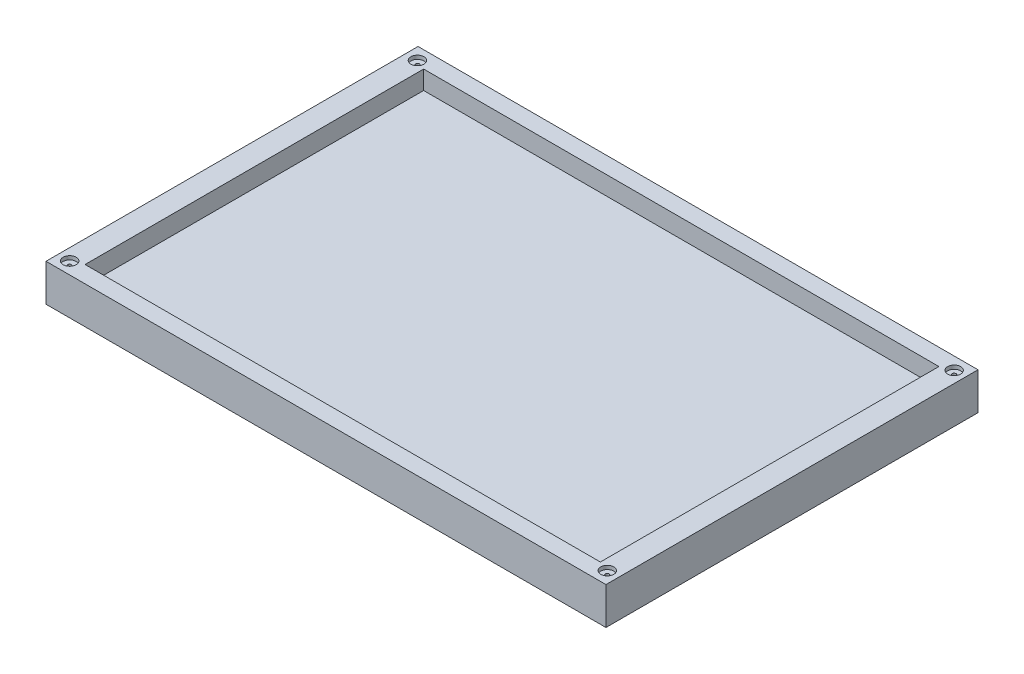
ISO-10303-21;
HEADER;
FILE_DESCRIPTION(('STEP AP214'),'2;1');
FILE_NAME('part.step','',(''),(''),'','','');
FILE_SCHEMA(('AUTOMOTIVE_DESIGN { 1 0 10303 214 1 1 1 1 }'));
ENDSEC;
DATA;
#1=APPLICATION_CONTEXT('core data for automotive mechanical design processes');
#2=APPLICATION_PROTOCOL_DEFINITION('international standard','automotive_design',2000,#1);
#3=PRODUCT_CONTEXT('',#1,'mechanical');
#4=PRODUCT('Part','Part','',(#3));
#5=PRODUCT_RELATED_PRODUCT_CATEGORY('part','',(#4));
#6=PRODUCT_DEFINITION_FORMATION('','',#4);
#7=PRODUCT_DEFINITION_CONTEXT('part definition',#1,'design');
#8=PRODUCT_DEFINITION('design','',#6,#7);
#9=PRODUCT_DEFINITION_SHAPE('','',#8);
#10=(LENGTH_UNIT() NAMED_UNIT(*) SI_UNIT(.MILLI.,.METRE.));
#11=(NAMED_UNIT(*) PLANE_ANGLE_UNIT() SI_UNIT($,.RADIAN.));
#12=(NAMED_UNIT(*) SI_UNIT($,.STERADIAN.) SOLID_ANGLE_UNIT());
#13=UNCERTAINTY_MEASURE_WITH_UNIT(LENGTH_MEASURE(1.E-05),#10,'distance_accuracy_value','');
#14=(GEOMETRIC_REPRESENTATION_CONTEXT(3) GLOBAL_UNCERTAINTY_ASSIGNED_CONTEXT((#13)) GLOBAL_UNIT_ASSIGNED_CONTEXT((#10,
#11,#12)) REPRESENTATION_CONTEXT('',''));
#15=CARTESIAN_POINT('',(0.,0.,0.));
#16=DIRECTION('',(0.,0.,1.));
#17=DIRECTION('',(1.,0.,0.));
#18=AXIS2_PLACEMENT_3D('',#15,#16,#17);
#19=CARTESIAN_POINT('',(0.,5.,0.));
#20=DIRECTION('',(1.,0.,0.));
#21=DIRECTION('',(0.,0.,-1.));
#22=AXIS2_PLACEMENT_3D('',#19,#20,#21);
#23=PLANE('',#22);
#24=DIRECTION('',(0.,0.,1.));
#25=VECTOR('',#24,1.);
#26=CARTESIAN_POINT('',(0.,-5.,0.));
#27=LINE('',#26,#25);
#28=CARTESIAN_POINT('',(0.,-5.,-100.));
#29=VERTEX_POINT('',#28);
#30=CARTESIAN_POINT('',(0.,-5.,0.));
#31=VERTEX_POINT('',#30);
#32=EDGE_CURVE('E145',#29,#31,#27,.T.);
#33=ORIENTED_EDGE('',*,*,#32,.T.);
#34=DIRECTION('',(0.,-1.,0.));
#35=VECTOR('',#34,1.);
#36=CARTESIAN_POINT('',(0.,5.,0.));
#37=LINE('',#36,#35);
#38=CARTESIAN_POINT('',(0.,5.,0.));
#39=VERTEX_POINT('',#38);
#40=EDGE_CURVE('E11',#39,#31,#37,.T.);
#41=ORIENTED_EDGE('',*,*,#40,.F.);
#42=DIRECTION('',(0.,0.,1.));
#43=VECTOR('',#42,1.);
#44=CARTESIAN_POINT('',(0.,5.,0.));
#45=LINE('',#44,#43);
#46=CARTESIAN_POINT('',(0.,5.,-100.));
#47=VERTEX_POINT('',#46);
#48=EDGE_CURVE('E149',#47,#39,#45,.T.);
#49=ORIENTED_EDGE('',*,*,#48,.F.);
#50=DIRECTION('',(0.,-1.,0.));
#51=VECTOR('',#50,1.);
#52=CARTESIAN_POINT('',(0.,5.,-100.));
#53=LINE('',#52,#51);
#54=EDGE_CURVE('E155',#47,#29,#53,.T.);
#55=ORIENTED_EDGE('',*,*,#54,.T.);
#56=EDGE_LOOP('',(#33,#41,#49,#55));
#57=FACE_BOUND('',#56,.T.);
#58=ADVANCED_FACE('F33',(#57),#23,.F.);
#59=CARTESIAN_POINT('',(0.,5.,0.));
#60=DIRECTION('',(0.,0.,-1.));
#61=DIRECTION('',(-1.,0.,0.));
#62=AXIS2_PLACEMENT_3D('',#59,#60,#61);
#63=PLANE('',#62);
#64=DIRECTION('',(1.,0.,0.));
#65=VECTOR('',#64,1.);
#66=CARTESIAN_POINT('',(0.,-5.,0.));
#67=LINE('',#66,#65);
#68=CARTESIAN_POINT('',(150.5,-5.,0.));
#69=VERTEX_POINT('',#68);
#70=EDGE_CURVE('E158',#31,#69,#67,.T.);
#71=ORIENTED_EDGE('',*,*,#70,.T.);
#72=DIRECTION('',(0.,-1.,0.));
#73=VECTOR('',#72,1.);
#74=CARTESIAN_POINT('',(150.5,5.,0.));
#75=LINE('',#74,#73);
#76=CARTESIAN_POINT('',(150.5,5.,0.));
#77=VERTEX_POINT('',#76);
#78=EDGE_CURVE('E40',#77,#69,#75,.T.);
#79=ORIENTED_EDGE('',*,*,#78,.F.);
#80=DIRECTION('',(1.,0.,0.));
#81=VECTOR('',#80,1.);
#82=CARTESIAN_POINT('',(0.,5.,0.));
#83=LINE('',#82,#81);
#84=EDGE_CURVE('E84',#39,#77,#83,.T.);
#85=ORIENTED_EDGE('',*,*,#84,.F.);
#86=ORIENTED_EDGE('',*,*,#40,.T.);
#87=EDGE_LOOP('',(#71,#79,#85,#86));
#88=FACE_BOUND('',#87,.T.);
#89=ADVANCED_FACE('F187',(#88),#63,.F.);
#90=CARTESIAN_POINT('',(150.5,5.,0.));
#91=DIRECTION('',(-1.,0.,0.));
#92=DIRECTION('',(0.,0.,1.));
#93=AXIS2_PLACEMENT_3D('',#90,#91,#92);
#94=PLANE('',#93);
#95=DIRECTION('',(0.,0.,-1.));
#96=VECTOR('',#95,1.);
#97=CARTESIAN_POINT('',(150.5,-5.,0.));
#98=LINE('',#97,#96);
#99=CARTESIAN_POINT('',(150.5,-5.,-100.));
#100=VERTEX_POINT('',#99);
#101=EDGE_CURVE('E160',#69,#100,#98,.T.);
#102=ORIENTED_EDGE('',*,*,#101,.T.);
#103=DIRECTION('',(0.,-1.,0.));
#104=VECTOR('',#103,1.);
#105=CARTESIAN_POINT('',(150.5,5.,-100.));
#106=LINE('',#105,#104);
#107=CARTESIAN_POINT('',(150.5,5.,-100.));
#108=VERTEX_POINT('',#107);
#109=EDGE_CURVE('E164',#108,#100,#106,.T.);
#110=ORIENTED_EDGE('',*,*,#109,.F.);
#111=DIRECTION('',(0.,0.,-1.));
#112=VECTOR('',#111,1.);
#113=CARTESIAN_POINT('',(150.5,5.,0.));
#114=LINE('',#113,#112);
#115=EDGE_CURVE('E152',#77,#108,#114,.T.);
#116=ORIENTED_EDGE('',*,*,#115,.F.);
#117=ORIENTED_EDGE('',*,*,#78,.T.);
#118=EDGE_LOOP('',(#102,#110,#116,#117));
#119=FACE_BOUND('',#118,.T.);
#120=ADVANCED_FACE('F169',(#119),#94,.F.);
#121=CARTESIAN_POINT('',(0.,5.,-100.));
#122=DIRECTION('',(0.,0.,1.));
#123=DIRECTION('',(1.,0.,0.));
#124=AXIS2_PLACEMENT_3D('',#121,#122,#123);
#125=PLANE('',#124);
#126=DIRECTION('',(-1.,0.,0.));
#127=VECTOR('',#126,1.);
#128=CARTESIAN_POINT('',(0.,-5.,-100.));
#129=LINE('',#128,#127);
#130=EDGE_CURVE('E77',#100,#29,#129,.T.);
#131=ORIENTED_EDGE('',*,*,#130,.T.);
#132=ORIENTED_EDGE('',*,*,#54,.F.);
#133=DIRECTION('',(-1.,0.,0.));
#134=VECTOR('',#133,1.);
#135=CARTESIAN_POINT('',(0.,5.,-100.));
#136=LINE('',#135,#134);
#137=EDGE_CURVE('E56',#108,#47,#136,.T.);
#138=ORIENTED_EDGE('',*,*,#137,.F.);
#139=ORIENTED_EDGE('',*,*,#109,.T.);
#140=EDGE_LOOP('',(#131,#132,#138,#139));
#141=FACE_BOUND('',#140,.T.);
#142=ADVANCED_FACE('F177',(#141),#125,.F.);
#143=CARTESIAN_POINT('',(0.,5.,0.));
#144=DIRECTION('',(0.,-1.,0.));
#145=DIRECTION('',(0.,0.,-1.));
#146=AXIS2_PLACEMENT_3D('',#143,#144,#145);
#147=PLANE('',#146);
#148=CARTESIAN_POINT('',(147.430623057517,5.,-96.6621357084492));
#149=DIRECTION('',(0.,1.,0.));
#150=DIRECTION('',(0.,0.,1.));
#151=AXIS2_PLACEMENT_3D('',#148,#149,#150);
#152=CIRCLE('',#151,1.75000000000001);
#153=CARTESIAN_POINT('',(147.430623057517,5.,-94.9121357084492));
#154=VERTEX_POINT('',#153);
#155=EDGE_CURVE('E428',#154,#154,#152,.T.);
#156=ORIENTED_EDGE('',*,*,#155,.F.);
#157=EDGE_LOOP('',(#156));
#158=FACE_BOUND('',#157,.T.);
#159=CARTESIAN_POINT('',(147.430623057517,5.,-3.43690086949189));
#160=DIRECTION('',(0.,1.,0.));
#161=DIRECTION('',(0.,0.,1.));
#162=AXIS2_PLACEMENT_3D('',#159,#160,#161);
#163=CIRCLE('',#162,1.75000000000001);
#164=CARTESIAN_POINT('',(147.430623057517,5.,-1.68690086949188));
#165=VERTEX_POINT('',#164);
#166=EDGE_CURVE('E450',#165,#165,#163,.T.);
#167=ORIENTED_EDGE('',*,*,#166,.F.);
#168=EDGE_LOOP('',(#167));
#169=FACE_BOUND('',#168,.T.);
#170=CARTESIAN_POINT('',(3.10278833403273,5.,-3.2545276414705));
#171=DIRECTION('',(0.,1.,0.));
#172=DIRECTION('',(0.,0.,1.));
#173=AXIS2_PLACEMENT_3D('',#170,#171,#172);
#174=CIRCLE('',#173,1.75);
#175=CARTESIAN_POINT('',(3.10278833403273,5.,-1.5045276414705));
#176=VERTEX_POINT('',#175);
#177=EDGE_CURVE('E444',#176,#176,#174,.T.);
#178=ORIENTED_EDGE('',*,*,#177,.F.);
#179=EDGE_LOOP('',(#178));
#180=FACE_BOUND('',#179,.T.);
#181=CARTESIAN_POINT('',(3.15907973459417,5.,-96.6621357084492));
#182=DIRECTION('',(0.,1.,0.));
#183=DIRECTION('',(0.,0.,1.));
#184=AXIS2_PLACEMENT_3D('',#181,#182,#183);
#185=CIRCLE('',#184,1.75);
#186=CARTESIAN_POINT('',(3.15907973459417,5.,-94.9121357084492));
#187=VERTEX_POINT('',#186);
#188=EDGE_CURVE('E132',#187,#187,#185,.T.);
#189=ORIENTED_EDGE('',*,*,#188,.F.);
#190=EDGE_LOOP('',(#189));
#191=FACE_BOUND('',#190,.T.);
#192=DIRECTION('',(1.,0.,0.));
#193=VECTOR('',#192,1.);
#194=CARTESIAN_POINT('',(6.00000000000001,5.,-4.5));
#195=LINE('',#194,#193);
#196=CARTESIAN_POINT('',(6.00000000000001,5.,-4.5));
#197=VERTEX_POINT('',#196);
#198=CARTESIAN_POINT('',(144.5,5.,-4.5));
#199=VERTEX_POINT('',#198);
#200=EDGE_CURVE('E138',#197,#199,#195,.T.);
#201=ORIENTED_EDGE('',*,*,#200,.F.);
#202=DIRECTION('',(0.,0.,1.));
#203=VECTOR('',#202,1.);
#204=CARTESIAN_POINT('',(6.,5.,-95.5));
#205=LINE('',#204,#203);
#206=CARTESIAN_POINT('',(6.,5.,-95.5));
#207=VERTEX_POINT('',#206);
#208=EDGE_CURVE('E47',#207,#197,#205,.T.);
#209=ORIENTED_EDGE('',*,*,#208,.F.);
#210=DIRECTION('',(-1.,0.,0.));
#211=VECTOR('',#210,1.);
#212=CARTESIAN_POINT('',(6.,5.,-95.5));
#213=LINE('',#212,#211);
#214=CARTESIAN_POINT('',(144.5,5.,-95.5));
#215=VERTEX_POINT('',#214);
#216=EDGE_CURVE('E126',#215,#207,#213,.T.);
#217=ORIENTED_EDGE('',*,*,#216,.F.);
#218=DIRECTION('',(0.,0.,-1.));
#219=VECTOR('',#218,1.);
#220=CARTESIAN_POINT('',(144.5,5.,-95.5));
#221=LINE('',#220,#219);
#222=EDGE_CURVE('E129',#199,#215,#221,.T.);
#223=ORIENTED_EDGE('',*,*,#222,.F.);
#224=EDGE_LOOP('',(#201,#209,#217,#223));
#225=FACE_BOUND('',#224,.T.);
#226=ORIENTED_EDGE('',*,*,#48,.T.);
#227=ORIENTED_EDGE('',*,*,#84,.T.);
#228=ORIENTED_EDGE('',*,*,#115,.T.);
#229=ORIENTED_EDGE('',*,*,#137,.T.);
#230=EDGE_LOOP('',(#226,#227,#228,#229));
#231=FACE_BOUND('',#230,.T.);
#232=ADVANCED_FACE('F179',(#158,#169,#180,#191,#225,#231),#147,.F.);
#233=CARTESIAN_POINT('',(0.,-5.,0.));
#234=DIRECTION('',(0.,-1.,0.));
#235=DIRECTION('',(0.,0.,-1.));
#236=AXIS2_PLACEMENT_3D('',#233,#234,#235);
#237=PLANE('',#236);
#238=ORIENTED_EDGE('',*,*,#32,.F.);
#239=ORIENTED_EDGE('',*,*,#130,.F.);
#240=ORIENTED_EDGE('',*,*,#101,.F.);
#241=ORIENTED_EDGE('',*,*,#70,.F.);
#242=EDGE_LOOP('',(#238,#239,#240,#241));
#243=FACE_BOUND('',#242,.T.);
#244=ADVANCED_FACE('F173',(#243),#237,.T.);
#245=CARTESIAN_POINT('',(6.,0.,-95.5));
#246=DIRECTION('',(-1.,0.,0.));
#247=DIRECTION('',(0.,0.,1.));
#248=AXIS2_PLACEMENT_3D('',#245,#246,#247);
#249=PLANE('',#248);
#250=ORIENTED_EDGE('',*,*,#208,.T.);
#251=DIRECTION('',(0.,1.,0.));
#252=VECTOR('',#251,1.);
#253=CARTESIAN_POINT('',(6.00000000000001,0.,-4.5));
#254=LINE('',#253,#252);
#255=CARTESIAN_POINT('',(6.00000000000001,0.,-4.5));
#256=VERTEX_POINT('',#255);
#257=EDGE_CURVE('E104',#256,#197,#254,.T.);
#258=ORIENTED_EDGE('',*,*,#257,.F.);
#259=DIRECTION('',(0.,0.,1.));
#260=VECTOR('',#259,1.);
#261=CARTESIAN_POINT('',(6.,0.,-95.5));
#262=LINE('',#261,#260);
#263=CARTESIAN_POINT('',(6.,0.,-95.5));
#264=VERTEX_POINT('',#263);
#265=EDGE_CURVE('E108',#264,#256,#262,.T.);
#266=ORIENTED_EDGE('',*,*,#265,.F.);
#267=DIRECTION('',(0.,1.,0.));
#268=VECTOR('',#267,1.);
#269=CARTESIAN_POINT('',(6.,0.,-95.5));
#270=LINE('',#269,#268);
#271=EDGE_CURVE('E143',#264,#207,#270,.T.);
#272=ORIENTED_EDGE('',*,*,#271,.T.);
#273=EDGE_LOOP('',(#250,#258,#266,#272));
#274=FACE_BOUND('',#273,.T.);
#275=ADVANCED_FACE('F106',(#274),#249,.F.);
#276=CARTESIAN_POINT('',(6.,0.,-95.5));
#277=DIRECTION('',(0.,0.,-1.));
#278=DIRECTION('',(-1.,0.,0.));
#279=AXIS2_PLACEMENT_3D('',#276,#277,#278);
#280=PLANE('',#279);
#281=ORIENTED_EDGE('',*,*,#216,.T.);
#282=ORIENTED_EDGE('',*,*,#271,.F.);
#283=DIRECTION('',(-1.,0.,0.));
#284=VECTOR('',#283,1.);
#285=CARTESIAN_POINT('',(6.,0.,-95.5));
#286=LINE('',#285,#284);
#287=CARTESIAN_POINT('',(144.5,0.,-95.5));
#288=VERTEX_POINT('',#287);
#289=EDGE_CURVE('E114',#288,#264,#286,.T.);
#290=ORIENTED_EDGE('',*,*,#289,.F.);
#291=DIRECTION('',(0.,1.,0.));
#292=VECTOR('',#291,1.);
#293=CARTESIAN_POINT('',(144.5,0.,-95.5));
#294=LINE('',#293,#292);
#295=EDGE_CURVE('E146',#288,#215,#294,.T.);
#296=ORIENTED_EDGE('',*,*,#295,.T.);
#297=EDGE_LOOP('',(#281,#282,#290,#296));
#298=FACE_BOUND('',#297,.T.);
#299=ADVANCED_FACE('F221',(#298),#280,.F.);
#300=CARTESIAN_POINT('',(144.5,0.,-95.5));
#301=DIRECTION('',(1.,0.,0.));
#302=DIRECTION('',(0.,0.,-1.));
#303=AXIS2_PLACEMENT_3D('',#300,#301,#302);
#304=PLANE('',#303);
#305=ORIENTED_EDGE('',*,*,#222,.T.);
#306=ORIENTED_EDGE('',*,*,#295,.F.);
#307=DIRECTION('',(0.,0.,-1.));
#308=VECTOR('',#307,1.);
#309=CARTESIAN_POINT('',(144.5,0.,-95.5));
#310=LINE('',#309,#308);
#311=CARTESIAN_POINT('',(144.5,0.,-4.5));
#312=VERTEX_POINT('',#311);
#313=EDGE_CURVE('E122',#312,#288,#310,.T.);
#314=ORIENTED_EDGE('',*,*,#313,.F.);
#315=DIRECTION('',(0.,1.,0.));
#316=VECTOR('',#315,1.);
#317=CARTESIAN_POINT('',(144.5,0.,-4.5));
#318=LINE('',#317,#316);
#319=EDGE_CURVE('E113',#312,#199,#318,.T.);
#320=ORIENTED_EDGE('',*,*,#319,.T.);
#321=EDGE_LOOP('',(#305,#306,#314,#320));
#322=FACE_BOUND('',#321,.T.);
#323=ADVANCED_FACE('F230',(#322),#304,.F.);
#324=CARTESIAN_POINT('',(6.00000000000001,0.,-4.5));
#325=DIRECTION('',(0.,0.,1.));
#326=DIRECTION('',(1.,0.,0.));
#327=AXIS2_PLACEMENT_3D('',#324,#325,#326);
#328=PLANE('',#327);
#329=ORIENTED_EDGE('',*,*,#200,.T.);
#330=ORIENTED_EDGE('',*,*,#319,.F.);
#331=DIRECTION('',(1.,0.,0.));
#332=VECTOR('',#331,1.);
#333=CARTESIAN_POINT('',(6.00000000000001,0.,-4.5));
#334=LINE('',#333,#332);
#335=EDGE_CURVE('E117',#256,#312,#334,.T.);
#336=ORIENTED_EDGE('',*,*,#335,.F.);
#337=ORIENTED_EDGE('',*,*,#257,.T.);
#338=EDGE_LOOP('',(#329,#330,#336,#337));
#339=FACE_BOUND('',#338,.T.);
#340=ADVANCED_FACE('F118',(#339),#328,.F.);
#341=CARTESIAN_POINT('',(0.,0.,0.));
#342=DIRECTION('',(0.,1.,0.));
#343=DIRECTION('',(0.,0.,1.));
#344=AXIS2_PLACEMENT_3D('',#341,#342,#343);
#345=PLANE('',#344);
#346=ORIENTED_EDGE('',*,*,#265,.T.);
#347=ORIENTED_EDGE('',*,*,#335,.T.);
#348=ORIENTED_EDGE('',*,*,#313,.T.);
#349=ORIENTED_EDGE('',*,*,#289,.T.);
#350=EDGE_LOOP('',(#346,#347,#348,#349));
#351=FACE_BOUND('',#350,.T.);
#352=ADVANCED_FACE('F124',(#351),#345,.T.);
#353=CARTESIAN_POINT('',(3.15907973459417,4.,-96.6621357084492));
#354=DIRECTION('',(0.,1.,0.));
#355=DIRECTION('',(0.,0.,1.));
#356=AXIS2_PLACEMENT_3D('',#353,#354,#355);
#357=CYLINDRICAL_SURFACE('',#356,1.75);
#358=CARTESIAN_POINT('',(3.15907973459417,4.,-96.6621357084492));
#359=DIRECTION('',(0.,1.,0.));
#360=DIRECTION('',(0.,0.,1.));
#361=AXIS2_PLACEMENT_3D('',#358,#359,#360);
#362=CIRCLE('',#361,1.75);
#363=CARTESIAN_POINT('',(3.15907973459417,4.,-94.9121357084492));
#364=VERTEX_POINT('',#363);
#365=EDGE_CURVE('E139',#364,#364,#362,.T.);
#366=ORIENTED_EDGE('',*,*,#365,.F.);
#367=EDGE_LOOP('',(#366));
#368=FACE_BOUND('',#367,.T.);
#369=ORIENTED_EDGE('',*,*,#188,.T.);
#370=EDGE_LOOP('',(#369));
#371=FACE_BOUND('',#370,.T.);
#372=ADVANCED_FACE('F257',(#368,#371),#357,.F.);
#373=CARTESIAN_POINT('',(3.15907973459417,4.,-96.6621357084492));
#374=DIRECTION('',(0.,1.,0.));
#375=DIRECTION('',(0.,0.,1.));
#376=AXIS2_PLACEMENT_3D('',#373,#374,#375);
#377=PLANE('',#376);
#378=CARTESIAN_POINT('',(3.21252490637036,4.,-96.6472310601318));
#379=DIRECTION('',(0.,1.,0.));
#380=DIRECTION('',(0.,0.,1.));
#381=AXIS2_PLACEMENT_3D('',#378,#379,#380);
#382=CIRCLE('',#381,0.5);
#383=CARTESIAN_POINT('',(3.21252490637036,4.,-96.1472310601318));
#384=VERTEX_POINT('',#383);
#385=EDGE_CURVE('E429',#384,#384,#382,.T.);
#386=ORIENTED_EDGE('',*,*,#385,.F.);
#387=EDGE_LOOP('',(#386));
#388=FACE_BOUND('',#387,.T.);
#389=ORIENTED_EDGE('',*,*,#365,.T.);
#390=EDGE_LOOP('',(#389));
#391=FACE_BOUND('',#390,.T.);
#392=ADVANCED_FACE('F271',(#388,#391),#377,.T.);
#393=CARTESIAN_POINT('',(3.10278833403273,4.,-3.2545276414705));
#394=DIRECTION('',(0.,1.,0.));
#395=DIRECTION('',(0.,0.,1.));
#396=AXIS2_PLACEMENT_3D('',#393,#394,#395);
#397=CYLINDRICAL_SURFACE('',#396,1.75);
#398=CARTESIAN_POINT('',(3.10278833403273,4.,-3.2545276414705));
#399=DIRECTION('',(0.,1.,0.));
#400=DIRECTION('',(0.,0.,1.));
#401=AXIS2_PLACEMENT_3D('',#398,#399,#400);
#402=CIRCLE('',#401,1.75);
#403=CARTESIAN_POINT('',(3.10278833403273,4.,-1.5045276414705));
#404=VERTEX_POINT('',#403);
#405=EDGE_CURVE('E441',#404,#404,#402,.T.);
#406=ORIENTED_EDGE('',*,*,#405,.F.);
#407=EDGE_LOOP('',(#406));
#408=FACE_BOUND('',#407,.T.);
#409=ORIENTED_EDGE('',*,*,#177,.T.);
#410=EDGE_LOOP('',(#409));
#411=FACE_BOUND('',#410,.T.);
#412=ADVANCED_FACE('F279',(#408,#411),#397,.F.);
#413=CARTESIAN_POINT('',(3.10278833403273,4.,-3.2545276414705));
#414=DIRECTION('',(0.,1.,0.));
#415=DIRECTION('',(0.,0.,1.));
#416=AXIS2_PLACEMENT_3D('',#413,#414,#415);
#417=PLANE('',#416);
#418=CARTESIAN_POINT('',(3.17577295968089,4.,-3.12853443829945));
#419=DIRECTION('',(0.,1.,0.));
#420=DIRECTION('',(0.,0.,1.));
#421=AXIS2_PLACEMENT_3D('',#418,#419,#420);
#422=CIRCLE('',#421,0.5);
#423=CARTESIAN_POINT('',(3.17577295968089,4.,-2.62853443829945));
#424=VERTEX_POINT('',#423);
#425=EDGE_CURVE('E488',#424,#424,#422,.T.);
#426=ORIENTED_EDGE('',*,*,#425,.F.);
#427=EDGE_LOOP('',(#426));
#428=FACE_BOUND('',#427,.T.);
#429=ORIENTED_EDGE('',*,*,#405,.T.);
#430=EDGE_LOOP('',(#429));
#431=FACE_BOUND('',#430,.T.);
#432=ADVANCED_FACE('F284',(#428,#431),#417,.T.);
#433=CARTESIAN_POINT('',(147.430623057517,4.,-3.43690086949189));
#434=DIRECTION('',(0.,1.,0.));
#435=DIRECTION('',(0.,0.,1.));
#436=AXIS2_PLACEMENT_3D('',#433,#434,#435);
#437=CYLINDRICAL_SURFACE('',#436,1.75000000000001);
#438=CARTESIAN_POINT('',(147.430623057517,4.,-3.43690086949189));
#439=DIRECTION('',(0.,1.,0.));
#440=DIRECTION('',(0.,0.,1.));
#441=AXIS2_PLACEMENT_3D('',#438,#439,#440);
#442=CIRCLE('',#441,1.75000000000001);
#443=CARTESIAN_POINT('',(147.430623057517,4.,-1.68690086949188));
#444=VERTEX_POINT('',#443);
#445=EDGE_CURVE('E447',#444,#444,#442,.T.);
#446=ORIENTED_EDGE('',*,*,#445,.F.);
#447=EDGE_LOOP('',(#446));
#448=FACE_BOUND('',#447,.T.);
#449=ORIENTED_EDGE('',*,*,#166,.T.);
#450=EDGE_LOOP('',(#449));
#451=FACE_BOUND('',#450,.T.);
#452=ADVANCED_FACE('F292',(#448,#451),#437,.F.);
#453=CARTESIAN_POINT('',(147.430623057517,4.,-3.43690086949189));
#454=DIRECTION('',(0.,1.,0.));
#455=DIRECTION('',(0.,0.,1.));
#456=AXIS2_PLACEMENT_3D('',#453,#454,#455);
#457=PLANE('',#456);
#458=CARTESIAN_POINT('',(147.423404744391,4.,-3.43856291503947));
#459=DIRECTION('',(0.,1.,0.));
#460=DIRECTION('',(0.,0.,1.));
#461=AXIS2_PLACEMENT_3D('',#458,#459,#460);
#462=CIRCLE('',#461,0.499999999999999);
#463=CARTESIAN_POINT('',(147.423404744391,4.,-2.93856291503947));
#464=VERTEX_POINT('',#463);
#465=EDGE_CURVE('E482',#464,#464,#462,.T.);
#466=ORIENTED_EDGE('',*,*,#465,.F.);
#467=EDGE_LOOP('',(#466));
#468=FACE_BOUND('',#467,.T.);
#469=ORIENTED_EDGE('',*,*,#445,.T.);
#470=EDGE_LOOP('',(#469));
#471=FACE_BOUND('',#470,.T.);
#472=ADVANCED_FACE('F297',(#468,#471),#457,.T.);
#473=CARTESIAN_POINT('',(147.430623057517,4.,-96.6621357084492));
#474=DIRECTION('',(0.,1.,0.));
#475=DIRECTION('',(0.,0.,1.));
#476=AXIS2_PLACEMENT_3D('',#473,#474,#475);
#477=CYLINDRICAL_SURFACE('',#476,1.75000000000001);
#478=CARTESIAN_POINT('',(147.430623057517,4.,-96.6621357084492));
#479=DIRECTION('',(0.,1.,0.));
#480=DIRECTION('',(0.,0.,1.));
#481=AXIS2_PLACEMENT_3D('',#478,#479,#480);
#482=CIRCLE('',#481,1.75000000000001);
#483=CARTESIAN_POINT('',(147.430623057517,4.,-94.9121357084492));
#484=VERTEX_POINT('',#483);
#485=EDGE_CURVE('E432',#484,#484,#482,.T.);
#486=ORIENTED_EDGE('',*,*,#485,.F.);
#487=EDGE_LOOP('',(#486));
#488=FACE_BOUND('',#487,.T.);
#489=ORIENTED_EDGE('',*,*,#155,.T.);
#490=EDGE_LOOP('',(#489));
#491=FACE_BOUND('',#490,.T.);
#492=ADVANCED_FACE('F305',(#488,#491),#477,.F.);
#493=CARTESIAN_POINT('',(147.430623057517,4.,-96.6621357084492));
#494=DIRECTION('',(0.,1.,0.));
#495=DIRECTION('',(0.,0.,1.));
#496=AXIS2_PLACEMENT_3D('',#493,#494,#495);
#497=PLANE('',#496);
#498=CARTESIAN_POINT('',(147.430623057517,4.,-96.6621357084492));
#499=DIRECTION('',(0.,1.,0.));
#500=DIRECTION('',(0.,0.,1.));
#501=AXIS2_PLACEMENT_3D('',#498,#499,#500);
#502=CIRCLE('',#501,0.499999999999999);
#503=CARTESIAN_POINT('',(147.430623057517,4.,-96.1621357084492));
#504=VERTEX_POINT('',#503);
#505=EDGE_CURVE('E438',#504,#504,#502,.T.);
#506=ORIENTED_EDGE('',*,*,#505,.F.);
#507=EDGE_LOOP('',(#506));
#508=FACE_BOUND('',#507,.T.);
#509=ORIENTED_EDGE('',*,*,#485,.T.);
#510=EDGE_LOOP('',(#509));
#511=FACE_BOUND('',#510,.T.);
#512=ADVANCED_FACE('F310',(#508,#511),#497,.T.);
#513=CARTESIAN_POINT('',(147.430623057517,-1.,-96.6621357084492));
#514=DIRECTION('',(0.,1.,0.));
#515=DIRECTION('',(0.,0.,1.));
#516=AXIS2_PLACEMENT_3D('',#513,#514,#515);
#517=CYLINDRICAL_SURFACE('',#516,0.499999999999999);
#518=CARTESIAN_POINT('',(147.430623057517,-1.,-96.6621357084492));
#519=DIRECTION('',(0.,1.,0.));
#520=DIRECTION('',(0.,0.,1.));
#521=AXIS2_PLACEMENT_3D('',#518,#519,#520);
#522=CIRCLE('',#521,0.499999999999999);
#523=CARTESIAN_POINT('',(147.430623057517,-1.,-96.1621357084492));
#524=VERTEX_POINT('',#523);
#525=EDGE_CURVE('E479',#524,#524,#522,.T.);
#526=ORIENTED_EDGE('',*,*,#525,.F.);
#527=EDGE_LOOP('',(#526));
#528=FACE_BOUND('',#527,.T.);
#529=ORIENTED_EDGE('',*,*,#505,.T.);
#530=EDGE_LOOP('',(#529));
#531=FACE_BOUND('',#530,.T.);
#532=ADVANCED_FACE('F341',(#528,#531),#517,.F.);
#533=CARTESIAN_POINT('',(147.430623057517,-1.,-96.6621357084492));
#534=DIRECTION('',(0.,1.,0.));
#535=DIRECTION('',(0.,0.,1.));
#536=AXIS2_PLACEMENT_3D('',#533,#534,#535);
#537=PLANE('',#536);
#538=ORIENTED_EDGE('',*,*,#525,.T.);
#539=EDGE_LOOP('',(#538));
#540=FACE_BOUND('',#539,.T.);
#541=ADVANCED_FACE('F351',(#540),#537,.T.);
#542=CARTESIAN_POINT('',(147.423404744391,-1.,-3.43856291503947));
#543=DIRECTION('',(0.,1.,0.));
#544=DIRECTION('',(0.,0.,1.));
#545=AXIS2_PLACEMENT_3D('',#542,#543,#544);
#546=CYLINDRICAL_SURFACE('',#545,0.499999999999999);
#547=CARTESIAN_POINT('',(147.423404744391,-1.,-3.43856291503947));
#548=DIRECTION('',(0.,1.,0.));
#549=DIRECTION('',(0.,0.,1.));
#550=AXIS2_PLACEMENT_3D('',#547,#548,#549);
#551=CIRCLE('',#550,0.499999999999999);
#552=CARTESIAN_POINT('',(147.423404744391,-1.,-2.93856291503947));
#553=VERTEX_POINT('',#552);
#554=EDGE_CURVE('E485',#553,#553,#551,.T.);
#555=ORIENTED_EDGE('',*,*,#554,.F.);
#556=EDGE_LOOP('',(#555));
#557=FACE_BOUND('',#556,.T.);
#558=ORIENTED_EDGE('',*,*,#465,.T.);
#559=EDGE_LOOP('',(#558));
#560=FACE_BOUND('',#559,.T.);
#561=ADVANCED_FACE('F361',(#557,#560),#546,.F.);
#562=CARTESIAN_POINT('',(147.423404744391,-1.,-3.43856291503947));
#563=DIRECTION('',(0.,1.,0.));
#564=DIRECTION('',(0.,0.,1.));
#565=AXIS2_PLACEMENT_3D('',#562,#563,#564);
#566=PLANE('',#565);
#567=ORIENTED_EDGE('',*,*,#554,.T.);
#568=EDGE_LOOP('',(#567));
#569=FACE_BOUND('',#568,.T.);
#570=ADVANCED_FACE('F371',(#569),#566,.T.);
#571=CARTESIAN_POINT('',(3.17577295968089,-1.,-3.12853443829945));
#572=DIRECTION('',(0.,1.,0.));
#573=DIRECTION('',(0.,0.,1.));
#574=AXIS2_PLACEMENT_3D('',#571,#572,#573);
#575=CYLINDRICAL_SURFACE('',#574,0.5);
#576=CARTESIAN_POINT('',(3.17577295968089,-1.,-3.12853443829945));
#577=DIRECTION('',(0.,1.,0.));
#578=DIRECTION('',(0.,0.,1.));
#579=AXIS2_PLACEMENT_3D('',#576,#577,#578);
#580=CIRCLE('',#579,0.5);
#581=CARTESIAN_POINT('',(3.17577295968089,-1.,-2.62853443829945));
#582=VERTEX_POINT('',#581);
#583=EDGE_CURVE('E435',#582,#582,#580,.T.);
#584=ORIENTED_EDGE('',*,*,#583,.F.);
#585=EDGE_LOOP('',(#584));
#586=FACE_BOUND('',#585,.T.);
#587=ORIENTED_EDGE('',*,*,#425,.T.);
#588=EDGE_LOOP('',(#587));
#589=FACE_BOUND('',#588,.T.);
#590=ADVANCED_FACE('F381',(#586,#589),#575,.F.);
#591=CARTESIAN_POINT('',(3.17577295968089,-1.,-3.12853443829945));
#592=DIRECTION('',(0.,1.,0.));
#593=DIRECTION('',(0.,0.,1.));
#594=AXIS2_PLACEMENT_3D('',#591,#592,#593);
#595=PLANE('',#594);
#596=ORIENTED_EDGE('',*,*,#583,.T.);
#597=EDGE_LOOP('',(#596));
#598=FACE_BOUND('',#597,.T.);
#599=ADVANCED_FACE('F391',(#598),#595,.T.);
#600=CARTESIAN_POINT('',(3.21252490637036,-1.,-96.6472310601318));
#601=DIRECTION('',(0.,1.,0.));
#602=DIRECTION('',(0.,0.,1.));
#603=AXIS2_PLACEMENT_3D('',#600,#601,#602);
#604=CYLINDRICAL_SURFACE('',#603,0.5);
#605=CARTESIAN_POINT('',(3.21252490637036,-1.,-96.6472310601318));
#606=DIRECTION('',(0.,1.,0.));
#607=DIRECTION('',(0.,0.,1.));
#608=AXIS2_PLACEMENT_3D('',#605,#606,#607);
#609=CIRCLE('',#608,0.5);
#610=CARTESIAN_POINT('',(3.21252490637036,-1.,-96.1472310601318));
#611=VERTEX_POINT('',#610);
#612=EDGE_CURVE('E427',#611,#611,#609,.T.);
#613=ORIENTED_EDGE('',*,*,#612,.F.);
#614=EDGE_LOOP('',(#613));
#615=FACE_BOUND('',#614,.T.);
#616=ORIENTED_EDGE('',*,*,#385,.T.);
#617=EDGE_LOOP('',(#616));
#618=FACE_BOUND('',#617,.T.);
#619=ADVANCED_FACE('F401',(#615,#618),#604,.F.);
#620=CARTESIAN_POINT('',(3.21252490637036,-1.,-96.6472310601318));
#621=DIRECTION('',(0.,1.,0.));
#622=DIRECTION('',(0.,0.,1.));
#623=AXIS2_PLACEMENT_3D('',#620,#621,#622);
#624=PLANE('',#623);
#625=ORIENTED_EDGE('',*,*,#612,.T.);
#626=EDGE_LOOP('',(#625));
#627=FACE_BOUND('',#626,.T.);
#628=ADVANCED_FACE('F411',(#627),#624,.T.);
#629=CLOSED_SHELL('',(#58,#89,#120,#142,#232,#244,#275,#299,#323,#340,#352,#372,#392,#412,#432,
#452,#472,#492,#512,#532,#541,#561,#570,#590,#599,#619,#628));
#630=MANIFOLD_SOLID_BREP('B2',#629);
#631=ADVANCED_BREP_SHAPE_REPRESENTATION('',(#18,#630),#14);
#632=SHAPE_DEFINITION_REPRESENTATION(#9,#631);
ENDSEC;
END-ISO-10303-21;
